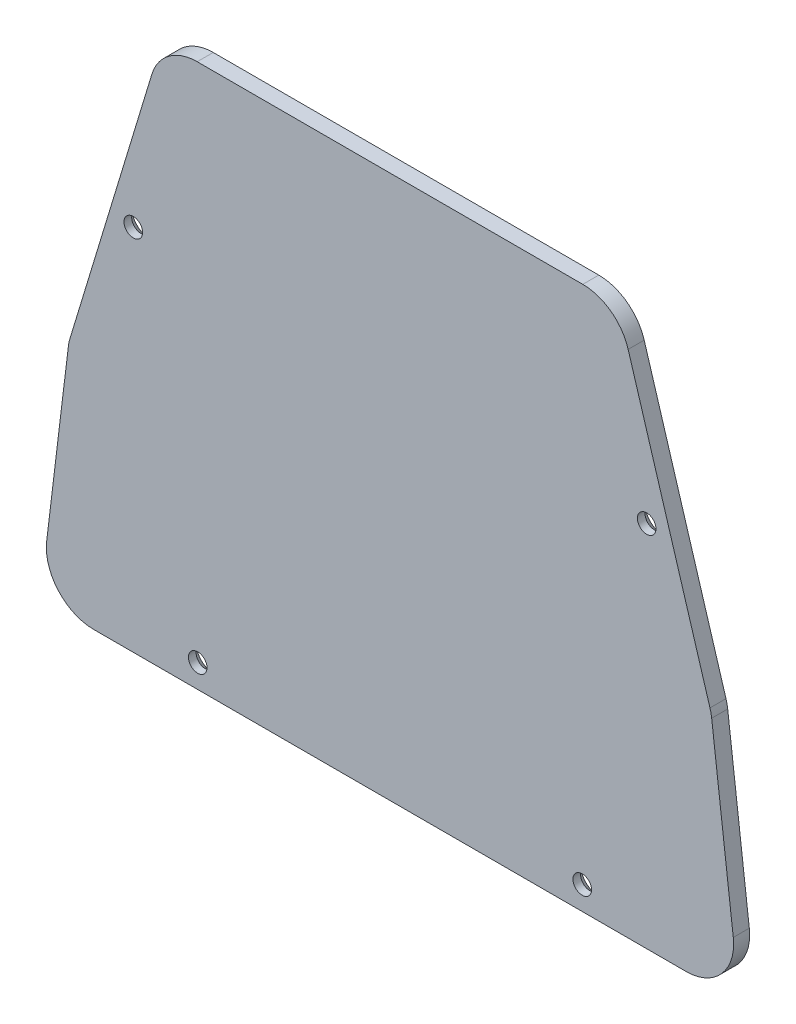
ISO-10303-21;
HEADER;
FILE_DESCRIPTION(('STEP AP214'),'2;1');
FILE_NAME('part.step','',(''),(''),'','','');
FILE_SCHEMA(('AUTOMOTIVE_DESIGN { 1 0 10303 214 1 1 1 1 }'));
ENDSEC;
DATA;
#1=APPLICATION_CONTEXT('core data for automotive mechanical design processes');
#2=APPLICATION_PROTOCOL_DEFINITION('international standard','automotive_design',2000,#1);
#3=PRODUCT_CONTEXT('',#1,'mechanical');
#4=PRODUCT('Part','Part','',(#3));
#5=PRODUCT_RELATED_PRODUCT_CATEGORY('part','',(#4));
#6=PRODUCT_DEFINITION_FORMATION('','',#4);
#7=PRODUCT_DEFINITION_CONTEXT('part definition',#1,'design');
#8=PRODUCT_DEFINITION('design','',#6,#7);
#9=PRODUCT_DEFINITION_SHAPE('','',#8);
#10=(LENGTH_UNIT() NAMED_UNIT(*) SI_UNIT(.MILLI.,.METRE.));
#11=(NAMED_UNIT(*) PLANE_ANGLE_UNIT() SI_UNIT($,.RADIAN.));
#12=(NAMED_UNIT(*) SI_UNIT($,.STERADIAN.) SOLID_ANGLE_UNIT());
#13=UNCERTAINTY_MEASURE_WITH_UNIT(LENGTH_MEASURE(1.E-05),#10,'distance_accuracy_value','');
#14=(GEOMETRIC_REPRESENTATION_CONTEXT(3) GLOBAL_UNCERTAINTY_ASSIGNED_CONTEXT((#13)) GLOBAL_UNIT_ASSIGNED_CONTEXT((#10,
#11,#12)) REPRESENTATION_CONTEXT('',''));
#15=CARTESIAN_POINT('',(0.,0.,0.));
#16=DIRECTION('',(0.,0.,1.));
#17=DIRECTION('',(1.,0.,0.));
#18=AXIS2_PLACEMENT_3D('',#15,#16,#17);
#19=CARTESIAN_POINT('',(42.8498240762928,-7.06664816706446,2.5));
#20=DIRECTION('',(0.,0.,-1.));
#21=DIRECTION('',(-1.,0.,0.));
#22=AXIS2_PLACEMENT_3D('',#19,#20,#21);
#23=CYLINDRICAL_SURFACE('',#22,7.4);
#24=CARTESIAN_POINT('',(42.8498240762928,-7.06664816706446,0.));
#25=DIRECTION('',(0.,0.,-1.));
#26=DIRECTION('',(-1.,0.,0.));
#27=AXIS2_PLACEMENT_3D('',#24,#25,#26);
#28=CIRCLE('',#27,7.4);
#29=CARTESIAN_POINT('',(49.9309604130893,-4.91780936908557,0.));
#30=VERTEX_POINT('',#29);
#31=CARTESIAN_POINT('',(50.1965239822755,-6.18008147953723,0.));
#32=VERTEX_POINT('',#31);
#33=EDGE_CURVE('E159',#30,#32,#28,.T.);
#34=ORIENTED_EDGE('',*,*,#33,.F.);
#35=DIRECTION('',(0.,0.,-1.));
#36=VECTOR('',#35,1.);
#37=CARTESIAN_POINT('',(49.9309604130893,-4.91780936908557,2.5));
#38=LINE('',#37,#36);
#39=CARTESIAN_POINT('',(49.9309604130893,-4.91780936908557,2.5));
#40=VERTEX_POINT('',#39);
#41=EDGE_CURVE('E11',#40,#30,#38,.T.);
#42=ORIENTED_EDGE('',*,*,#41,.F.);
#43=CARTESIAN_POINT('',(42.8498240762928,-7.06664816706446,2.5));
#44=DIRECTION('',(0.,0.,-1.));
#45=DIRECTION('',(-1.,0.,0.));
#46=AXIS2_PLACEMENT_3D('',#43,#44,#45);
#47=CIRCLE('',#46,7.4);
#48=CARTESIAN_POINT('',(50.1965239822755,-6.18008147953723,2.5));
#49=VERTEX_POINT('',#48);
#50=EDGE_CURVE('E192',#40,#49,#47,.T.);
#51=ORIENTED_EDGE('',*,*,#50,.T.);
#52=DIRECTION('',(0.,0.,-1.));
#53=VECTOR('',#52,1.);
#54=CARTESIAN_POINT('',(50.1965239822755,-6.18008147953723,2.5));
#55=LINE('',#54,#53);
#56=EDGE_CURVE('E105',#49,#32,#55,.T.);
#57=ORIENTED_EDGE('',*,*,#56,.T.);
#58=EDGE_LOOP('',(#34,#42,#51,#57));
#59=FACE_BOUND('',#58,.T.);
#60=ADVANCED_FACE('F37',(#59),#23,.T.);
#61=CARTESIAN_POINT('',(37.1654322008179,37.1488387979789,2.5));
#62=DIRECTION('',(0.956910315783318,0.290383621348501,0.));
#63=DIRECTION('',(-0.290383621348501,0.956910315783318,0.));
#64=AXIS2_PLACEMENT_3D('',#61,#62,#63);
#65=PLANE('',#64);
#66=DIRECTION('',(0.290383621348501,-0.956910315783318,0.));
#67=VECTOR('',#66,1.);
#68=CARTESIAN_POINT('',(37.1654322008179,37.1488387979789,0.));
#69=LINE('',#68,#67);
#70=CARTESIAN_POINT('',(37.1654322008179,37.1488387979789,0.));
#71=VERTEX_POINT('',#70);
#72=EDGE_CURVE('E190',#71,#30,#69,.T.);
#73=ORIENTED_EDGE('',*,*,#72,.F.);
#74=DIRECTION('',(0.,0.,-1.));
#75=VECTOR('',#74,1.);
#76=CARTESIAN_POINT('',(37.1654322008179,37.1488387979789,2.5));
#77=LINE('',#76,#75);
#78=CARTESIAN_POINT('',(37.1654322008179,37.1488387979789,2.5));
#79=VERTEX_POINT('',#78);
#80=EDGE_CURVE('E46',#79,#71,#77,.T.);
#81=ORIENTED_EDGE('',*,*,#80,.F.);
#82=DIRECTION('',(0.290383621348501,-0.956910315783318,0.));
#83=VECTOR('',#82,1.);
#84=CARTESIAN_POINT('',(37.1654322008179,37.1488387979789,2.5));
#85=LINE('',#84,#83);
#86=EDGE_CURVE('E149',#79,#40,#85,.T.);
#87=ORIENTED_EDGE('',*,*,#86,.T.);
#88=ORIENTED_EDGE('',*,*,#41,.T.);
#89=EDGE_LOOP('',(#73,#81,#87,#88));
#90=FACE_BOUND('',#89,.T.);
#91=ADVANCED_FACE('F287',(#90),#65,.T.);
#92=CARTESIAN_POINT('',(30.0842958640214,35.,2.5));
#93=DIRECTION('',(0.,0.,-1.));
#94=DIRECTION('',(-1.,0.,0.));
#95=AXIS2_PLACEMENT_3D('',#92,#93,#94);
#96=CYLINDRICAL_SURFACE('',#95,7.4);
#97=CARTESIAN_POINT('',(30.0842958640214,35.,0.));
#98=DIRECTION('',(0.,0.,-1.));
#99=DIRECTION('',(-1.,0.,0.));
#100=AXIS2_PLACEMENT_3D('',#97,#98,#99);
#101=CIRCLE('',#100,7.4);
#102=CARTESIAN_POINT('',(30.0842958640214,42.4,0.));
#103=VERTEX_POINT('',#102);
#104=EDGE_CURVE('E136',#103,#71,#101,.T.);
#105=ORIENTED_EDGE('',*,*,#104,.F.);
#106=DIRECTION('',(0.,0.,-1.));
#107=VECTOR('',#106,1.);
#108=CARTESIAN_POINT('',(30.0842958640214,42.4,2.5));
#109=LINE('',#108,#107);
#110=CARTESIAN_POINT('',(30.0842958640214,42.4,2.5));
#111=VERTEX_POINT('',#110);
#112=EDGE_CURVE('E131',#111,#103,#109,.T.);
#113=ORIENTED_EDGE('',*,*,#112,.F.);
#114=CARTESIAN_POINT('',(30.0842958640214,35.,2.5));
#115=DIRECTION('',(0.,0.,-1.));
#116=DIRECTION('',(-1.,0.,0.));
#117=AXIS2_PLACEMENT_3D('',#114,#115,#116);
#118=CIRCLE('',#117,7.4);
#119=EDGE_CURVE('E134',#111,#79,#118,.T.);
#120=ORIENTED_EDGE('',*,*,#119,.T.);
#121=ORIENTED_EDGE('',*,*,#80,.T.);
#122=EDGE_LOOP('',(#105,#113,#120,#121));
#123=FACE_BOUND('',#122,.T.);
#124=ADVANCED_FACE('F133',(#123),#96,.T.);
#125=CARTESIAN_POINT('',(-30.0842958640214,42.4,2.5));
#126=DIRECTION('',(0.,1.,0.));
#127=DIRECTION('',(0.,0.,1.));
#128=AXIS2_PLACEMENT_3D('',#125,#126,#127);
#129=PLANE('',#128);
#130=DIRECTION('',(1.,0.,0.));
#131=VECTOR('',#130,1.);
#132=CARTESIAN_POINT('',(-30.0842958640214,42.4,0.));
#133=LINE('',#132,#131);
#134=CARTESIAN_POINT('',(-30.0842958640214,42.4,0.));
#135=VERTEX_POINT('',#134);
#136=EDGE_CURVE('E187',#135,#103,#133,.T.);
#137=ORIENTED_EDGE('',*,*,#136,.F.);
#138=DIRECTION('',(0.,0.,-1.));
#139=VECTOR('',#138,1.);
#140=CARTESIAN_POINT('',(-30.0842958640214,42.4,2.5));
#141=LINE('',#140,#139);
#142=CARTESIAN_POINT('',(-30.0842958640214,42.4,2.5));
#143=VERTEX_POINT('',#142);
#144=EDGE_CURVE('E141',#143,#135,#141,.T.);
#145=ORIENTED_EDGE('',*,*,#144,.F.);
#146=DIRECTION('',(1.,0.,0.));
#147=VECTOR('',#146,1.);
#148=CARTESIAN_POINT('',(-30.0842958640214,42.4,2.5));
#149=LINE('',#148,#147);
#150=EDGE_CURVE('E147',#143,#111,#149,.T.);
#151=ORIENTED_EDGE('',*,*,#150,.T.);
#152=ORIENTED_EDGE('',*,*,#112,.T.);
#153=EDGE_LOOP('',(#137,#145,#151,#152));
#154=FACE_BOUND('',#153,.T.);
#155=ADVANCED_FACE('F151',(#154),#129,.T.);
#156=CARTESIAN_POINT('',(-30.0842958640214,35.,2.5));
#157=DIRECTION('',(0.,0.,-1.));
#158=DIRECTION('',(-1.,0.,0.));
#159=AXIS2_PLACEMENT_3D('',#156,#157,#158);
#160=CYLINDRICAL_SURFACE('',#159,7.4);
#161=CARTESIAN_POINT('',(-30.0842958640214,35.,0.));
#162=DIRECTION('',(0.,0.,-1.));
#163=DIRECTION('',(-1.,0.,0.));
#164=AXIS2_PLACEMENT_3D('',#161,#162,#163);
#165=CIRCLE('',#164,7.4);
#166=CARTESIAN_POINT('',(-37.1654322008179,37.1488387979789,0.));
#167=VERTEX_POINT('',#166);
#168=EDGE_CURVE('E184',#167,#135,#165,.T.);
#169=ORIENTED_EDGE('',*,*,#168,.F.);
#170=DIRECTION('',(0.,0.,-1.));
#171=VECTOR('',#170,1.);
#172=CARTESIAN_POINT('',(-37.1654322008179,37.1488387979789,2.5));
#173=LINE('',#172,#171);
#174=CARTESIAN_POINT('',(-37.1654322008179,37.1488387979789,2.5));
#175=VERTEX_POINT('',#174);
#176=EDGE_CURVE('E196',#175,#167,#173,.T.);
#177=ORIENTED_EDGE('',*,*,#176,.F.);
#178=CARTESIAN_POINT('',(-30.0842958640214,35.,2.5));
#179=DIRECTION('',(0.,0.,-1.));
#180=DIRECTION('',(-1.,0.,0.));
#181=AXIS2_PLACEMENT_3D('',#178,#179,#180);
#182=CIRCLE('',#181,7.4);
#183=EDGE_CURVE('E152',#175,#143,#182,.T.);
#184=ORIENTED_EDGE('',*,*,#183,.T.);
#185=ORIENTED_EDGE('',*,*,#144,.T.);
#186=EDGE_LOOP('',(#169,#177,#184,#185));
#187=FACE_BOUND('',#186,.T.);
#188=ADVANCED_FACE('F300',(#187),#160,.T.);
#189=CARTESIAN_POINT('',(-49.9309604130893,-4.91780936908553,2.5));
#190=DIRECTION('',(-0.956910315783318,0.290383621348501,0.));
#191=DIRECTION('',(-0.290383621348501,-0.956910315783319,0.));
#192=AXIS2_PLACEMENT_3D('',#189,#190,#191);
#193=PLANE('',#192);
#194=DIRECTION('',(0.290383621348501,0.956910315783319,0.));
#195=VECTOR('',#194,1.);
#196=CARTESIAN_POINT('',(-49.9309604130893,-4.91780936908553,0.));
#197=LINE('',#196,#195);
#198=CARTESIAN_POINT('',(-49.9309604130893,-4.91780936908553,0.));
#199=VERTEX_POINT('',#198);
#200=EDGE_CURVE('E181',#199,#167,#197,.T.);
#201=ORIENTED_EDGE('',*,*,#200,.F.);
#202=DIRECTION('',(0.,0.,-1.));
#203=VECTOR('',#202,1.);
#204=CARTESIAN_POINT('',(-49.9309604130893,-4.91780936908553,2.5));
#205=LINE('',#204,#203);
#206=CARTESIAN_POINT('',(-49.9309604130893,-4.91780936908553,2.5));
#207=VERTEX_POINT('',#206);
#208=EDGE_CURVE('E198',#207,#199,#205,.T.);
#209=ORIENTED_EDGE('',*,*,#208,.F.);
#210=DIRECTION('',(0.290383621348501,0.956910315783319,0.));
#211=VECTOR('',#210,1.);
#212=CARTESIAN_POINT('',(-49.9309604130893,-4.91780936908553,2.5));
#213=LINE('',#212,#211);
#214=EDGE_CURVE('E154',#207,#175,#213,.T.);
#215=ORIENTED_EDGE('',*,*,#214,.T.);
#216=ORIENTED_EDGE('',*,*,#176,.T.);
#217=EDGE_LOOP('',(#201,#209,#215,#216));
#218=FACE_BOUND('',#217,.T.);
#219=ADVANCED_FACE('F262',(#218),#193,.T.);
#220=CARTESIAN_POINT('',(-42.8498240762927,-7.06664816706444,2.5));
#221=DIRECTION('',(0.,0.,-1.));
#222=DIRECTION('',(-1.,0.,0.));
#223=AXIS2_PLACEMENT_3D('',#220,#221,#222);
#224=CYLINDRICAL_SURFACE('',#223,7.4);
#225=CARTESIAN_POINT('',(-42.8498240762927,-7.06664816706444,0.));
#226=DIRECTION('',(0.,0.,-1.));
#227=DIRECTION('',(-1.,0.,0.));
#228=AXIS2_PLACEMENT_3D('',#225,#226,#227);
#229=CIRCLE('',#228,7.4);
#230=CARTESIAN_POINT('',(-50.1965239822755,-6.1800814795372,0.));
#231=VERTEX_POINT('',#230);
#232=EDGE_CURVE('E178',#231,#199,#229,.T.);
#233=ORIENTED_EDGE('',*,*,#232,.F.);
#234=DIRECTION('',(0.,0.,-1.));
#235=VECTOR('',#234,1.);
#236=CARTESIAN_POINT('',(-50.1965239822755,-6.1800814795372,2.5));
#237=LINE('',#236,#235);
#238=CARTESIAN_POINT('',(-50.1965239822755,-6.1800814795372,2.5));
#239=VERTEX_POINT('',#238);
#240=EDGE_CURVE('E200',#239,#231,#237,.T.);
#241=ORIENTED_EDGE('',*,*,#240,.F.);
#242=CARTESIAN_POINT('',(-42.8498240762927,-7.06664816706444,2.5));
#243=DIRECTION('',(0.,0.,-1.));
#244=DIRECTION('',(-1.,0.,0.));
#245=AXIS2_PLACEMENT_3D('',#242,#243,#244);
#246=CIRCLE('',#245,7.4);
#247=EDGE_CURVE('E256',#239,#207,#246,.T.);
#248=ORIENTED_EDGE('',*,*,#247,.T.);
#249=ORIENTED_EDGE('',*,*,#208,.T.);
#250=EDGE_LOOP('',(#233,#241,#248,#249));
#251=FACE_BOUND('',#250,.T.);
#252=ADVANCED_FACE('F268',(#251),#224,.T.);
#253=CARTESIAN_POINT('',(-53.5673951928841,-34.1134333124728,2.5));
#254=DIRECTION('',(-0.992797284592264,0.119806309125303,0.));
#255=DIRECTION('',(-0.119806309125303,-0.992797284592264,0.));
#256=AXIS2_PLACEMENT_3D('',#253,#254,#255);
#257=PLANE('',#256);
#258=DIRECTION('',(0.119806309125303,0.992797284592264,0.));
#259=VECTOR('',#258,1.);
#260=CARTESIAN_POINT('',(-53.5673951928841,-34.1134333124728,0.));
#261=LINE('',#260,#259);
#262=CARTESIAN_POINT('',(-53.5673951928841,-34.1134333124728,0.));
#263=VERTEX_POINT('',#262);
#264=EDGE_CURVE('E175',#263,#231,#261,.T.);
#265=ORIENTED_EDGE('',*,*,#264,.F.);
#266=DIRECTION('',(0.,0.,-1.));
#267=VECTOR('',#266,1.);
#268=CARTESIAN_POINT('',(-53.5673951928841,-34.1134333124728,2.5));
#269=LINE('',#268,#267);
#270=CARTESIAN_POINT('',(-53.5673951928841,-34.1134333124728,2.5));
#271=VERTEX_POINT('',#270);
#272=EDGE_CURVE('E202',#271,#263,#269,.T.);
#273=ORIENTED_EDGE('',*,*,#272,.F.);
#274=DIRECTION('',(0.119806309125303,0.992797284592264,0.));
#275=VECTOR('',#274,1.);
#276=CARTESIAN_POINT('',(-53.5673951928841,-34.1134333124728,2.5));
#277=LINE('',#276,#275);
#278=EDGE_CURVE('E253',#271,#239,#277,.T.);
#279=ORIENTED_EDGE('',*,*,#278,.T.);
#280=ORIENTED_EDGE('',*,*,#240,.T.);
#281=EDGE_LOOP('',(#265,#273,#279,#280));
#282=FACE_BOUND('',#281,.T.);
#283=ADVANCED_FACE('F271',(#282),#257,.T.);
#284=CARTESIAN_POINT('',(-46.2206952869014,-35.,2.5));
#285=DIRECTION('',(0.,0.,-1.));
#286=DIRECTION('',(-1.,0.,0.));
#287=AXIS2_PLACEMENT_3D('',#284,#285,#286);
#288=CYLINDRICAL_SURFACE('',#287,7.40000000000001);
#289=CARTESIAN_POINT('',(-46.2206952869014,-35.,0.));
#290=DIRECTION('',(0.,0.,-1.));
#291=DIRECTION('',(-1.,0.,0.));
#292=AXIS2_PLACEMENT_3D('',#289,#290,#291);
#293=CIRCLE('',#292,7.40000000000001);
#294=CARTESIAN_POINT('',(-46.2206952869014,-42.4,0.));
#295=VERTEX_POINT('',#294);
#296=EDGE_CURVE('E172',#295,#263,#293,.T.);
#297=ORIENTED_EDGE('',*,*,#296,.F.);
#298=DIRECTION('',(0.,0.,-1.));
#299=VECTOR('',#298,1.);
#300=CARTESIAN_POINT('',(-46.2206952869014,-42.4,2.5));
#301=LINE('',#300,#299);
#302=CARTESIAN_POINT('',(-46.2206952869014,-42.4,2.5));
#303=VERTEX_POINT('',#302);
#304=EDGE_CURVE('E204',#303,#295,#301,.T.);
#305=ORIENTED_EDGE('',*,*,#304,.F.);
#306=CARTESIAN_POINT('',(-46.2206952869014,-35.,2.5));
#307=DIRECTION('',(0.,0.,-1.));
#308=DIRECTION('',(-1.,0.,0.));
#309=AXIS2_PLACEMENT_3D('',#306,#307,#308);
#310=CIRCLE('',#309,7.40000000000001);
#311=EDGE_CURVE('E250',#303,#271,#310,.T.);
#312=ORIENTED_EDGE('',*,*,#311,.T.);
#313=ORIENTED_EDGE('',*,*,#272,.T.);
#314=EDGE_LOOP('',(#297,#305,#312,#313));
#315=FACE_BOUND('',#314,.T.);
#316=ADVANCED_FACE('F276',(#315),#288,.T.);
#317=CARTESIAN_POINT('',(46.2206952869014,-42.4,2.5));
#318=DIRECTION('',(0.,-1.,0.));
#319=DIRECTION('',(1.,0.,0.));
#320=AXIS2_PLACEMENT_3D('',#317,#318,#319);
#321=PLANE('',#320);
#322=DIRECTION('',(-1.,0.,0.));
#323=VECTOR('',#322,1.);
#324=CARTESIAN_POINT('',(46.2206952869014,-42.4,0.));
#325=LINE('',#324,#323);
#326=CARTESIAN_POINT('',(46.2206952869014,-42.4,0.));
#327=VERTEX_POINT('',#326);
#328=EDGE_CURVE('E169',#327,#295,#325,.T.);
#329=ORIENTED_EDGE('',*,*,#328,.F.);
#330=DIRECTION('',(0.,0.,-1.));
#331=VECTOR('',#330,1.);
#332=CARTESIAN_POINT('',(46.2206952869014,-42.4,2.5));
#333=LINE('',#332,#331);
#334=CARTESIAN_POINT('',(46.2206952869014,-42.4,2.5));
#335=VERTEX_POINT('',#334);
#336=EDGE_CURVE('E206',#335,#327,#333,.T.);
#337=ORIENTED_EDGE('',*,*,#336,.F.);
#338=DIRECTION('',(-1.,0.,0.));
#339=VECTOR('',#338,1.);
#340=CARTESIAN_POINT('',(46.2206952869014,-42.4,2.5));
#341=LINE('',#340,#339);
#342=EDGE_CURVE('E247',#335,#303,#341,.T.);
#343=ORIENTED_EDGE('',*,*,#342,.T.);
#344=ORIENTED_EDGE('',*,*,#304,.T.);
#345=EDGE_LOOP('',(#329,#337,#343,#344));
#346=FACE_BOUND('',#345,.T.);
#347=ADVANCED_FACE('F279',(#346),#321,.T.);
#348=CARTESIAN_POINT('',(46.2206952869014,-35.,2.5));
#349=DIRECTION('',(0.,0.,-1.));
#350=DIRECTION('',(-1.,0.,0.));
#351=AXIS2_PLACEMENT_3D('',#348,#349,#350);
#352=CYLINDRICAL_SURFACE('',#351,7.4);
#353=CARTESIAN_POINT('',(46.2206952869014,-35.,0.));
#354=DIRECTION('',(0.,0.,-1.));
#355=DIRECTION('',(-1.,0.,0.));
#356=AXIS2_PLACEMENT_3D('',#353,#354,#355);
#357=CIRCLE('',#356,7.4);
#358=CARTESIAN_POINT('',(53.5673951928842,-34.1134333124728,0.));
#359=VERTEX_POINT('',#358);
#360=EDGE_CURVE('E166',#359,#327,#357,.T.);
#361=ORIENTED_EDGE('',*,*,#360,.F.);
#362=DIRECTION('',(0.,0.,-1.));
#363=VECTOR('',#362,1.);
#364=CARTESIAN_POINT('',(53.5673951928842,-34.1134333124728,2.5));
#365=LINE('',#364,#363);
#366=CARTESIAN_POINT('',(53.5673951928842,-34.1134333124728,2.5));
#367=VERTEX_POINT('',#366);
#368=EDGE_CURVE('E208',#367,#359,#365,.T.);
#369=ORIENTED_EDGE('',*,*,#368,.F.);
#370=CARTESIAN_POINT('',(46.2206952869014,-35.,2.5));
#371=DIRECTION('',(0.,0.,-1.));
#372=DIRECTION('',(-1.,0.,0.));
#373=AXIS2_PLACEMENT_3D('',#370,#371,#372);
#374=CIRCLE('',#373,7.4);
#375=EDGE_CURVE('E244',#367,#335,#374,.T.);
#376=ORIENTED_EDGE('',*,*,#375,.T.);
#377=ORIENTED_EDGE('',*,*,#336,.T.);
#378=EDGE_LOOP('',(#361,#369,#376,#377));
#379=FACE_BOUND('',#378,.T.);
#380=ADVANCED_FACE('F283',(#379),#352,.T.);
#381=CARTESIAN_POINT('',(50.1965239822755,-6.18008147953723,2.5));
#382=DIRECTION('',(0.992797284592264,0.119806309125303,0.));
#383=DIRECTION('',(-0.119806309125303,0.992797284592264,0.));
#384=AXIS2_PLACEMENT_3D('',#381,#382,#383);
#385=PLANE('',#384);
#386=DIRECTION('',(0.119806309125303,-0.992797284592264,0.));
#387=VECTOR('',#386,1.);
#388=CARTESIAN_POINT('',(50.1965239822755,-6.18008147953723,0.));
#389=LINE('',#388,#387);
#390=EDGE_CURVE('E162',#32,#359,#389,.T.);
#391=ORIENTED_EDGE('',*,*,#390,.F.);
#392=ORIENTED_EDGE('',*,*,#56,.F.);
#393=DIRECTION('',(0.119806309125303,-0.992797284592264,0.));
#394=VECTOR('',#393,1.);
#395=CARTESIAN_POINT('',(50.1965239822755,-6.18008147953723,2.5));
#396=LINE('',#395,#394);
#397=EDGE_CURVE('E242',#49,#367,#396,.T.);
#398=ORIENTED_EDGE('',*,*,#397,.T.);
#399=ORIENTED_EDGE('',*,*,#368,.T.);
#400=EDGE_LOOP('',(#391,#392,#398,#399));
#401=FACE_BOUND('',#400,.T.);
#402=ADVANCED_FACE('F284',(#401),#385,.T.);
#403=CARTESIAN_POINT('',(42.8498240762928,-7.06664816706446,2.5));
#404=DIRECTION('',(0.,0.,-1.));
#405=DIRECTION('',(-1.,0.,0.));
#406=AXIS2_PLACEMENT_3D('',#403,#404,#405);
#407=PLANE('',#406);
#408=CARTESIAN_POINT('',(-30.,-38.75,2.5));
#409=DIRECTION('',(0.,0.,-1.));
#410=DIRECTION('',(-1.,0.,0.));
#411=AXIS2_PLACEMENT_3D('',#408,#409,#410);
#412=CIRCLE('',#411,1.45);
#413=CARTESIAN_POINT('',(-31.45,-38.75,2.5));
#414=VERTEX_POINT('',#413);
#415=EDGE_CURVE('E40',#414,#414,#412,.T.);
#416=ORIENTED_EDGE('',*,*,#415,.T.);
#417=EDGE_LOOP('',(#416));
#418=FACE_BOUND('',#417,.T.);
#419=CARTESIAN_POINT('',(30.,-38.75,2.5));
#420=DIRECTION('',(0.,0.,-1.));
#421=DIRECTION('',(-1.,0.,0.));
#422=AXIS2_PLACEMENT_3D('',#419,#420,#421);
#423=CIRCLE('',#422,1.45);
#424=CARTESIAN_POINT('',(28.55,-38.75,2.5));
#425=VERTEX_POINT('',#424);
#426=EDGE_CURVE('E218',#425,#425,#423,.T.);
#427=ORIENTED_EDGE('',*,*,#426,.T.);
#428=EDGE_LOOP('',(#427));
#429=FACE_BOUND('',#428,.T.);
#430=CARTESIAN_POINT('',(40.0554736543445,15.0556144965246,2.5));
#431=DIRECTION('',(0.,0.,-1.));
#432=DIRECTION('',(-1.,0.,0.));
#433=AXIS2_PLACEMENT_3D('',#430,#431,#432);
#434=CIRCLE('',#433,1.45);
#435=CARTESIAN_POINT('',(38.6054736543445,15.0556144965246,2.5));
#436=VERTEX_POINT('',#435);
#437=EDGE_CURVE('E214',#436,#436,#434,.T.);
#438=ORIENTED_EDGE('',*,*,#437,.T.);
#439=EDGE_LOOP('',(#438));
#440=FACE_BOUND('',#439,.T.);
#441=CARTESIAN_POINT('',(-40.0554736543445,15.0556144965247,2.5));
#442=DIRECTION('',(0.,0.,-1.));
#443=DIRECTION('',(-1.,0.,0.));
#444=AXIS2_PLACEMENT_3D('',#441,#442,#443);
#445=CIRCLE('',#444,1.45);
#446=CARTESIAN_POINT('',(-41.5054736543445,15.0556144965247,2.5));
#447=VERTEX_POINT('',#446);
#448=EDGE_CURVE('E163',#447,#447,#445,.T.);
#449=ORIENTED_EDGE('',*,*,#448,.T.);
#450=EDGE_LOOP('',(#449));
#451=FACE_BOUND('',#450,.T.);
#452=ORIENTED_EDGE('',*,*,#50,.F.);
#453=ORIENTED_EDGE('',*,*,#86,.F.);
#454=ORIENTED_EDGE('',*,*,#119,.F.);
#455=ORIENTED_EDGE('',*,*,#150,.F.);
#456=ORIENTED_EDGE('',*,*,#183,.F.);
#457=ORIENTED_EDGE('',*,*,#214,.F.);
#458=ORIENTED_EDGE('',*,*,#247,.F.);
#459=ORIENTED_EDGE('',*,*,#278,.F.);
#460=ORIENTED_EDGE('',*,*,#311,.F.);
#461=ORIENTED_EDGE('',*,*,#342,.F.);
#462=ORIENTED_EDGE('',*,*,#375,.F.);
#463=ORIENTED_EDGE('',*,*,#397,.F.);
#464=EDGE_LOOP('',(#452,#453,#454,#455,#456,#457,#458,#459,#460,#461,#462,#463));
#465=FACE_BOUND('',#464,.T.);
#466=ADVANCED_FACE('F145',(#418,#429,#440,#451,#465),#407,.F.);
#467=CARTESIAN_POINT('',(42.8498240762928,-7.06664816706446,0.));
#468=DIRECTION('',(0.,0.,-1.));
#469=DIRECTION('',(-1.,0.,0.));
#470=AXIS2_PLACEMENT_3D('',#467,#468,#469);
#471=PLANE('',#470);
#472=CARTESIAN_POINT('',(-30.,-38.75,0.));
#473=DIRECTION('',(0.,0.,-1.));
#474=DIRECTION('',(-1.,0.,0.));
#475=AXIS2_PLACEMENT_3D('',#472,#473,#474);
#476=CIRCLE('',#475,2.75);
#477=CARTESIAN_POINT('',(-32.75,-38.75,0.));
#478=VERTEX_POINT('',#477);
#479=EDGE_CURVE('E364',#478,#478,#476,.T.);
#480=ORIENTED_EDGE('',*,*,#479,.F.);
#481=EDGE_LOOP('',(#480));
#482=FACE_BOUND('',#481,.T.);
#483=CARTESIAN_POINT('',(30.,-38.75,0.));
#484=DIRECTION('',(0.,0.,-1.));
#485=DIRECTION('',(-1.,0.,0.));
#486=AXIS2_PLACEMENT_3D('',#483,#484,#485);
#487=CIRCLE('',#486,2.75);
#488=CARTESIAN_POINT('',(27.25,-38.75,0.));
#489=VERTEX_POINT('',#488);
#490=EDGE_CURVE('E227',#489,#489,#487,.T.);
#491=ORIENTED_EDGE('',*,*,#490,.F.);
#492=EDGE_LOOP('',(#491));
#493=FACE_BOUND('',#492,.T.);
#494=CARTESIAN_POINT('',(40.0554736543445,15.0556144965246,0.));
#495=DIRECTION('',(0.,0.,-1.));
#496=DIRECTION('',(-1.,0.,0.));
#497=AXIS2_PLACEMENT_3D('',#494,#495,#496);
#498=CIRCLE('',#497,2.75);
#499=CARTESIAN_POINT('',(37.3054736543445,15.0556144965246,0.));
#500=VERTEX_POINT('',#499);
#501=EDGE_CURVE('E220',#500,#500,#498,.T.);
#502=ORIENTED_EDGE('',*,*,#501,.F.);
#503=EDGE_LOOP('',(#502));
#504=FACE_BOUND('',#503,.T.);
#505=CARTESIAN_POINT('',(-40.0554736543445,15.0556144965247,0.));
#506=DIRECTION('',(0.,0.,-1.));
#507=DIRECTION('',(-1.,0.,0.));
#508=AXIS2_PLACEMENT_3D('',#505,#506,#507);
#509=CIRCLE('',#508,2.75);
#510=CARTESIAN_POINT('',(-42.8054736543445,15.0556144965247,0.));
#511=VERTEX_POINT('',#510);
#512=EDGE_CURVE('E216',#511,#511,#509,.T.);
#513=ORIENTED_EDGE('',*,*,#512,.F.);
#514=EDGE_LOOP('',(#513));
#515=FACE_BOUND('',#514,.T.);
#516=ORIENTED_EDGE('',*,*,#33,.T.);
#517=ORIENTED_EDGE('',*,*,#390,.T.);
#518=ORIENTED_EDGE('',*,*,#360,.T.);
#519=ORIENTED_EDGE('',*,*,#328,.T.);
#520=ORIENTED_EDGE('',*,*,#296,.T.);
#521=ORIENTED_EDGE('',*,*,#264,.T.);
#522=ORIENTED_EDGE('',*,*,#232,.T.);
#523=ORIENTED_EDGE('',*,*,#200,.T.);
#524=ORIENTED_EDGE('',*,*,#168,.T.);
#525=ORIENTED_EDGE('',*,*,#136,.T.);
#526=ORIENTED_EDGE('',*,*,#104,.T.);
#527=ORIENTED_EDGE('',*,*,#72,.T.);
#528=EDGE_LOOP('',(#516,#517,#518,#519,#520,#521,#522,#523,#524,#525,#526,#527));
#529=FACE_BOUND('',#528,.T.);
#530=ADVANCED_FACE('F286',(#482,#493,#504,#515,#529),#471,.T.);
#531=CARTESIAN_POINT('',(-40.0554736543445,15.0556144965247,0.));
#532=DIRECTION('',(0.,0.,-1.));
#533=DIRECTION('',(-1.,0.,0.));
#534=AXIS2_PLACEMENT_3D('',#531,#532,#533);
#535=CYLINDRICAL_SURFACE('',#534,1.45);
#536=CARTESIAN_POINT('',(-40.0554736543445,15.0556144965247,1.3));
#537=DIRECTION('',(0.,0.,-1.));
#538=DIRECTION('',(-1.,0.,0.));
#539=AXIS2_PLACEMENT_3D('',#536,#537,#538);
#540=CIRCLE('',#539,1.45);
#541=CARTESIAN_POINT('',(-41.5054736543445,15.0556144965247,1.3));
#542=VERTEX_POINT('',#541);
#543=EDGE_CURVE('E213',#542,#542,#540,.T.);
#544=ORIENTED_EDGE('',*,*,#543,.T.);
#545=EDGE_LOOP('',(#544));
#546=FACE_BOUND('',#545,.T.);
#547=ORIENTED_EDGE('',*,*,#448,.F.);
#548=EDGE_LOOP('',(#547));
#549=FACE_BOUND('',#548,.T.);
#550=ADVANCED_FACE('F323',(#546,#549),#535,.F.);
#551=CARTESIAN_POINT('',(-40.0554736543445,15.0556144965247,0.));
#552=DIRECTION('',(0.,0.,-1.));
#553=DIRECTION('',(-1.,0.,0.));
#554=AXIS2_PLACEMENT_3D('',#551,#552,#553);
#555=CONICAL_SURFACE('',#554,2.75,0.785398163397446);
#556=ORIENTED_EDGE('',*,*,#543,.F.);
#557=EDGE_LOOP('',(#556));
#558=FACE_BOUND('',#557,.T.);
#559=ORIENTED_EDGE('',*,*,#512,.T.);
#560=EDGE_LOOP('',(#559));
#561=FACE_BOUND('',#560,.T.);
#562=ADVANCED_FACE('F329',(#558,#561),#555,.F.);
#563=CARTESIAN_POINT('',(40.0554736543445,15.0556144965246,0.));
#564=DIRECTION('',(0.,0.,-1.));
#565=DIRECTION('',(-1.,0.,0.));
#566=AXIS2_PLACEMENT_3D('',#563,#564,#565);
#567=CYLINDRICAL_SURFACE('',#566,1.45);
#568=CARTESIAN_POINT('',(40.0554736543445,15.0556144965246,1.3));
#569=DIRECTION('',(0.,0.,-1.));
#570=DIRECTION('',(-1.,0.,0.));
#571=AXIS2_PLACEMENT_3D('',#568,#569,#570);
#572=CIRCLE('',#571,1.45);
#573=CARTESIAN_POINT('',(38.6054736543445,15.0556144965246,1.3));
#574=VERTEX_POINT('',#573);
#575=EDGE_CURVE('E217',#574,#574,#572,.T.);
#576=ORIENTED_EDGE('',*,*,#575,.T.);
#577=EDGE_LOOP('',(#576));
#578=FACE_BOUND('',#577,.T.);
#579=ORIENTED_EDGE('',*,*,#437,.F.);
#580=EDGE_LOOP('',(#579));
#581=FACE_BOUND('',#580,.T.);
#582=ADVANCED_FACE('F333',(#578,#581),#567,.F.);
#583=CARTESIAN_POINT('',(40.0554736543445,15.0556144965246,0.));
#584=DIRECTION('',(0.,0.,-1.));
#585=DIRECTION('',(-1.,0.,0.));
#586=AXIS2_PLACEMENT_3D('',#583,#584,#585);
#587=CONICAL_SURFACE('',#586,2.75,0.785398163397446);
#588=ORIENTED_EDGE('',*,*,#575,.F.);
#589=EDGE_LOOP('',(#588));
#590=FACE_BOUND('',#589,.T.);
#591=ORIENTED_EDGE('',*,*,#501,.T.);
#592=EDGE_LOOP('',(#591));
#593=FACE_BOUND('',#592,.T.);
#594=ADVANCED_FACE('F337',(#590,#593),#587,.F.);
#595=CARTESIAN_POINT('',(30.,-38.75,0.));
#596=DIRECTION('',(0.,0.,-1.));
#597=DIRECTION('',(-1.,0.,0.));
#598=AXIS2_PLACEMENT_3D('',#595,#596,#597);
#599=CYLINDRICAL_SURFACE('',#598,1.45);
#600=CARTESIAN_POINT('',(30.,-38.75,1.3));
#601=DIRECTION('',(0.,0.,-1.));
#602=DIRECTION('',(-1.,0.,0.));
#603=AXIS2_PLACEMENT_3D('',#600,#601,#602);
#604=CIRCLE('',#603,1.45);
#605=CARTESIAN_POINT('',(28.55,-38.75,1.3));
#606=VERTEX_POINT('',#605);
#607=EDGE_CURVE('E221',#606,#606,#604,.T.);
#608=ORIENTED_EDGE('',*,*,#607,.T.);
#609=EDGE_LOOP('',(#608));
#610=FACE_BOUND('',#609,.T.);
#611=ORIENTED_EDGE('',*,*,#426,.F.);
#612=EDGE_LOOP('',(#611));
#613=FACE_BOUND('',#612,.T.);
#614=ADVANCED_FACE('F341',(#610,#613),#599,.F.);
#615=CARTESIAN_POINT('',(30.,-38.75,0.));
#616=DIRECTION('',(0.,0.,-1.));
#617=DIRECTION('',(-1.,0.,0.));
#618=AXIS2_PLACEMENT_3D('',#615,#616,#617);
#619=CONICAL_SURFACE('',#618,2.75,0.785398163397448);
#620=ORIENTED_EDGE('',*,*,#607,.F.);
#621=EDGE_LOOP('',(#620));
#622=FACE_BOUND('',#621,.T.);
#623=ORIENTED_EDGE('',*,*,#490,.T.);
#624=EDGE_LOOP('',(#623));
#625=FACE_BOUND('',#624,.T.);
#626=ADVANCED_FACE('F345',(#622,#625),#619,.F.);
#627=CARTESIAN_POINT('',(-30.,-38.75,0.));
#628=DIRECTION('',(0.,0.,-1.));
#629=DIRECTION('',(-1.,0.,0.));
#630=AXIS2_PLACEMENT_3D('',#627,#628,#629);
#631=CYLINDRICAL_SURFACE('',#630,1.45);
#632=CARTESIAN_POINT('',(-30.,-38.75,1.3));
#633=DIRECTION('',(0.,0.,-1.));
#634=DIRECTION('',(-1.,0.,0.));
#635=AXIS2_PLACEMENT_3D('',#632,#633,#634);
#636=CIRCLE('',#635,1.45);
#637=CARTESIAN_POINT('',(-31.45,-38.75,1.3));
#638=VERTEX_POINT('',#637);
#639=EDGE_CURVE('E361',#638,#638,#636,.T.);
#640=ORIENTED_EDGE('',*,*,#639,.T.);
#641=EDGE_LOOP('',(#640));
#642=FACE_BOUND('',#641,.T.);
#643=ORIENTED_EDGE('',*,*,#415,.F.);
#644=EDGE_LOOP('',(#643));
#645=FACE_BOUND('',#644,.T.);
#646=ADVANCED_FACE('F348',(#642,#645),#631,.F.);
#647=CARTESIAN_POINT('',(-30.,-38.75,0.));
#648=DIRECTION('',(0.,0.,-1.));
#649=DIRECTION('',(-1.,0.,0.));
#650=AXIS2_PLACEMENT_3D('',#647,#648,#649);
#651=CONICAL_SURFACE('',#650,2.75,0.785398163397447);
#652=ORIENTED_EDGE('',*,*,#639,.F.);
#653=EDGE_LOOP('',(#652));
#654=FACE_BOUND('',#653,.T.);
#655=ORIENTED_EDGE('',*,*,#479,.T.);
#656=EDGE_LOOP('',(#655));
#657=FACE_BOUND('',#656,.T.);
#658=ADVANCED_FACE('F352',(#654,#657),#651,.F.);
#659=CLOSED_SHELL('',(#60,#91,#124,#155,#188,#219,#252,#283,#316,#347,#380,#402,#466,#530,#550,
#562,#582,#594,#614,#626,#646,#658));
#660=MANIFOLD_SOLID_BREP('B2',#659);
#661=ADVANCED_BREP_SHAPE_REPRESENTATION('',(#18,#660),#14);
#662=SHAPE_DEFINITION_REPRESENTATION(#9,#661);
ENDSEC;
END-ISO-10303-21;
